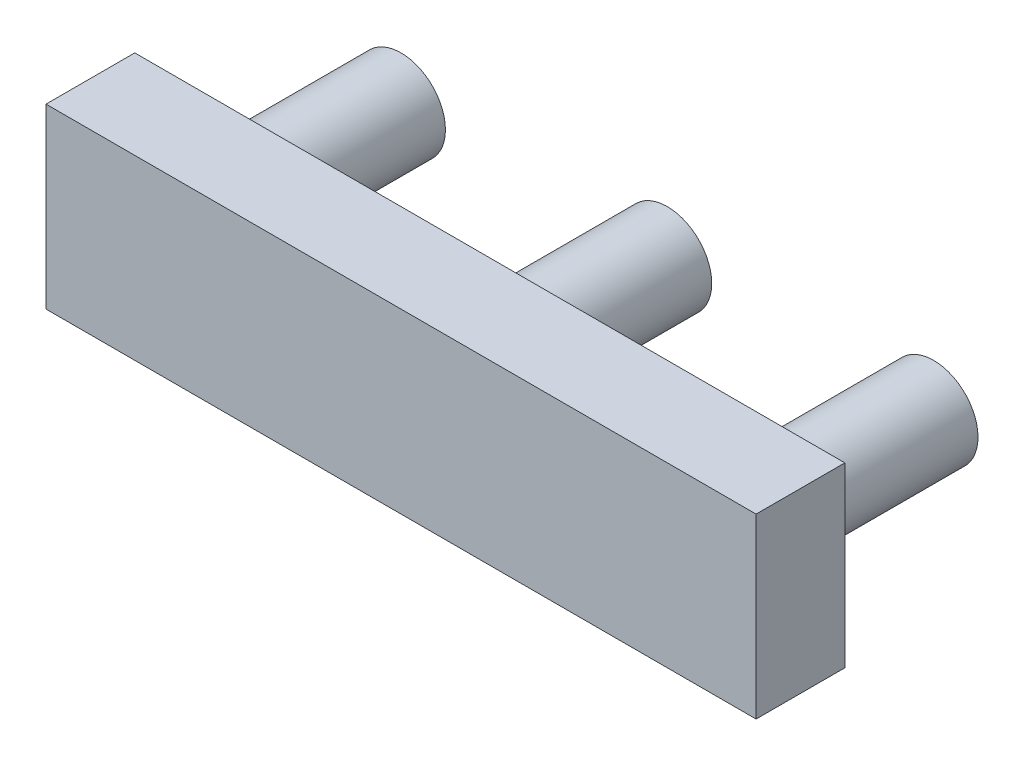
ISO-10303-21;
HEADER;
FILE_DESCRIPTION(('STEP AP214'),'2;1');
FILE_NAME('part.step','',(''),(''),'','','');
FILE_SCHEMA(('AUTOMOTIVE_DESIGN { 1 0 10303 214 1 1 1 1 }'));
ENDSEC;
DATA;
#1=APPLICATION_CONTEXT('core data for automotive mechanical design processes');
#2=APPLICATION_PROTOCOL_DEFINITION('international standard','automotive_design',2000,#1);
#3=PRODUCT_CONTEXT('',#1,'mechanical');
#4=PRODUCT('Part','Part','',(#3));
#5=PRODUCT_RELATED_PRODUCT_CATEGORY('part','',(#4));
#6=PRODUCT_DEFINITION_FORMATION('','',#4);
#7=PRODUCT_DEFINITION_CONTEXT('part definition',#1,'design');
#8=PRODUCT_DEFINITION('design','',#6,#7);
#9=PRODUCT_DEFINITION_SHAPE('','',#8);
#10=(LENGTH_UNIT() NAMED_UNIT(*) SI_UNIT(.MILLI.,.METRE.));
#11=(NAMED_UNIT(*) PLANE_ANGLE_UNIT() SI_UNIT($,.RADIAN.));
#12=(NAMED_UNIT(*) SI_UNIT($,.STERADIAN.) SOLID_ANGLE_UNIT());
#13=UNCERTAINTY_MEASURE_WITH_UNIT(LENGTH_MEASURE(1.E-05),#10,'distance_accuracy_value','');
#14=(GEOMETRIC_REPRESENTATION_CONTEXT(3) GLOBAL_UNCERTAINTY_ASSIGNED_CONTEXT((#13)) GLOBAL_UNIT_ASSIGNED_CONTEXT((#10,
#11,#12)) REPRESENTATION_CONTEXT('',''));
#15=CARTESIAN_POINT('',(0.,0.,0.));
#16=DIRECTION('',(0.,0.,1.));
#17=DIRECTION('',(1.,0.,0.));
#18=AXIS2_PLACEMENT_3D('',#15,#16,#17);
#19=CARTESIAN_POINT('',(0.,0.,12.7));
#20=DIRECTION('',(0.,0.,-1.));
#21=DIRECTION('',(-1.,0.,0.));
#22=AXIS2_PLACEMENT_3D('',#19,#20,#21);
#23=CYLINDRICAL_SURFACE('',#22,3.175);
#24=CARTESIAN_POINT('',(0.,0.,12.7));
#25=DIRECTION('',(0.,0.,1.));
#26=DIRECTION('',(1.,0.,0.));
#27=AXIS2_PLACEMENT_3D('',#24,#25,#26);
#28=CIRCLE('',#27,3.175);
#29=CARTESIAN_POINT('',(3.175,0.,12.7));
#30=VERTEX_POINT('',#29);
#31=EDGE_CURVE('E11',#30,#30,#28,.T.);
#32=ORIENTED_EDGE('',*,*,#31,.F.);
#33=EDGE_LOOP('',(#32));
#34=FACE_BOUND('',#33,.T.);
#35=CARTESIAN_POINT('',(0.,0.,0.));
#36=DIRECTION('',(0.,0.,1.));
#37=DIRECTION('',(1.,0.,0.));
#38=AXIS2_PLACEMENT_3D('',#35,#36,#37);
#39=CIRCLE('',#38,3.175);
#40=CARTESIAN_POINT('',(3.175,0.,0.));
#41=VERTEX_POINT('',#40);
#42=EDGE_CURVE('E36',#41,#41,#39,.T.);
#43=ORIENTED_EDGE('',*,*,#42,.T.);
#44=EDGE_LOOP('',(#43));
#45=FACE_BOUND('',#44,.T.);
#46=ADVANCED_FACE('F33',(#34,#45),#23,.T.);
#47=CARTESIAN_POINT('',(0.,0.,0.));
#48=DIRECTION('',(0.,0.,1.));
#49=DIRECTION('',(1.,0.,0.));
#50=AXIS2_PLACEMENT_3D('',#47,#48,#49);
#51=PLANE('',#50);
#52=ORIENTED_EDGE('',*,*,#42,.F.);
#53=EDGE_LOOP('',(#52));
#54=FACE_BOUND('',#53,.T.);
#55=ADVANCED_FACE('F113',(#54),#51,.F.);
#56=CARTESIAN_POINT('',(25.4,-6.35,19.05));
#57=DIRECTION('',(-1.,0.,0.));
#58=DIRECTION('',(0.,0.,1.));
#59=AXIS2_PLACEMENT_3D('',#56,#57,#58);
#60=PLANE('',#59);
#61=DIRECTION('',(0.,1.,0.));
#62=VECTOR('',#61,1.);
#63=CARTESIAN_POINT('',(25.4,-6.35,12.7));
#64=LINE('',#63,#62);
#65=CARTESIAN_POINT('',(25.4,-6.35,12.7));
#66=VERTEX_POINT('',#65);
#67=CARTESIAN_POINT('',(25.4,6.35,12.7));
#68=VERTEX_POINT('',#67);
#69=EDGE_CURVE('E100',#66,#68,#64,.T.);
#70=ORIENTED_EDGE('',*,*,#69,.T.);
#71=DIRECTION('',(0.,0.,-1.));
#72=VECTOR('',#71,1.);
#73=CARTESIAN_POINT('',(25.4,6.35,19.05));
#74=LINE('',#73,#72);
#75=CARTESIAN_POINT('',(25.4,6.35,19.05));
#76=VERTEX_POINT('',#75);
#77=EDGE_CURVE('E91',#76,#68,#74,.T.);
#78=ORIENTED_EDGE('',*,*,#77,.F.);
#79=DIRECTION('',(0.,1.,0.));
#80=VECTOR('',#79,1.);
#81=CARTESIAN_POINT('',(25.4,-6.35,19.05));
#82=LINE('',#81,#80);
#83=CARTESIAN_POINT('',(25.4,-6.35,19.05));
#84=VERTEX_POINT('',#83);
#85=EDGE_CURVE('E85',#84,#76,#82,.T.);
#86=ORIENTED_EDGE('',*,*,#85,.F.);
#87=DIRECTION('',(0.,0.,-1.));
#88=VECTOR('',#87,1.);
#89=CARTESIAN_POINT('',(25.4,-6.35,19.05));
#90=LINE('',#89,#88);
#91=EDGE_CURVE('E96',#84,#66,#90,.T.);
#92=ORIENTED_EDGE('',*,*,#91,.T.);
#93=EDGE_LOOP('',(#70,#78,#86,#92));
#94=FACE_BOUND('',#93,.T.);
#95=ADVANCED_FACE('F115',(#94),#60,.F.);
#96=CARTESIAN_POINT('',(-25.4,6.35,19.05));
#97=DIRECTION('',(0.,-1.,0.));
#98=DIRECTION('',(0.,0.,-1.));
#99=AXIS2_PLACEMENT_3D('',#96,#97,#98);
#100=PLANE('',#99);
#101=DIRECTION('',(-1.,0.,0.));
#102=VECTOR('',#101,1.);
#103=CARTESIAN_POINT('',(-25.4,6.35,12.7));
#104=LINE('',#103,#102);
#105=CARTESIAN_POINT('',(-25.4,6.35,12.7));
#106=VERTEX_POINT('',#105);
#107=EDGE_CURVE('E90',#68,#106,#104,.T.);
#108=ORIENTED_EDGE('',*,*,#107,.T.);
#109=DIRECTION('',(0.,0.,-1.));
#110=VECTOR('',#109,1.);
#111=CARTESIAN_POINT('',(-25.4,6.35,19.05));
#112=LINE('',#111,#110);
#113=CARTESIAN_POINT('',(-25.4,6.35,19.05));
#114=VERTEX_POINT('',#113);
#115=EDGE_CURVE('E88',#114,#106,#112,.T.);
#116=ORIENTED_EDGE('',*,*,#115,.F.);
#117=DIRECTION('',(-1.,0.,0.));
#118=VECTOR('',#117,1.);
#119=CARTESIAN_POINT('',(-25.4,6.35,19.05));
#120=LINE('',#119,#118);
#121=EDGE_CURVE('E80',#76,#114,#120,.T.);
#122=ORIENTED_EDGE('',*,*,#121,.F.);
#123=ORIENTED_EDGE('',*,*,#77,.T.);
#124=EDGE_LOOP('',(#108,#116,#122,#123));
#125=FACE_BOUND('',#124,.T.);
#126=ADVANCED_FACE('F89',(#125),#100,.F.);
#127=CARTESIAN_POINT('',(-25.4,-6.35,19.05));
#128=DIRECTION('',(1.,0.,0.));
#129=DIRECTION('',(0.,0.,-1.));
#130=AXIS2_PLACEMENT_3D('',#127,#128,#129);
#131=PLANE('',#130);
#132=DIRECTION('',(0.,-1.,0.));
#133=VECTOR('',#132,1.);
#134=CARTESIAN_POINT('',(-25.4,-6.35,12.7));
#135=LINE('',#134,#133);
#136=CARTESIAN_POINT('',(-25.4,-6.35,12.7));
#137=VERTEX_POINT('',#136);
#138=EDGE_CURVE('E66',#106,#137,#135,.T.);
#139=ORIENTED_EDGE('',*,*,#138,.T.);
#140=DIRECTION('',(0.,0.,-1.));
#141=VECTOR('',#140,1.);
#142=CARTESIAN_POINT('',(-25.4,-6.35,19.05));
#143=LINE('',#142,#141);
#144=CARTESIAN_POINT('',(-25.4,-6.35,19.05));
#145=VERTEX_POINT('',#144);
#146=EDGE_CURVE('E92',#145,#137,#143,.T.);
#147=ORIENTED_EDGE('',*,*,#146,.F.);
#148=DIRECTION('',(0.,-1.,0.));
#149=VECTOR('',#148,1.);
#150=CARTESIAN_POINT('',(-25.4,-6.35,19.05));
#151=LINE('',#150,#149);
#152=EDGE_CURVE('E83',#114,#145,#151,.T.);
#153=ORIENTED_EDGE('',*,*,#152,.F.);
#154=ORIENTED_EDGE('',*,*,#115,.T.);
#155=EDGE_LOOP('',(#139,#147,#153,#154));
#156=FACE_BOUND('',#155,.T.);
#157=ADVANCED_FACE('F94',(#156),#131,.F.);
#158=CARTESIAN_POINT('',(-25.4,-6.35,19.05));
#159=DIRECTION('',(0.,1.,0.));
#160=DIRECTION('',(0.,0.,1.));
#161=AXIS2_PLACEMENT_3D('',#158,#159,#160);
#162=PLANE('',#161);
#163=DIRECTION('',(1.,0.,0.));
#164=VECTOR('',#163,1.);
#165=CARTESIAN_POINT('',(-25.4,-6.35,12.7));
#166=LINE('',#165,#164);
#167=EDGE_CURVE('E72',#137,#66,#166,.T.);
#168=ORIENTED_EDGE('',*,*,#167,.T.);
#169=ORIENTED_EDGE('',*,*,#91,.F.);
#170=DIRECTION('',(1.,0.,0.));
#171=VECTOR('',#170,1.);
#172=CARTESIAN_POINT('',(-25.4,-6.35,19.05));
#173=LINE('',#172,#171);
#174=EDGE_CURVE('E49',#145,#84,#173,.T.);
#175=ORIENTED_EDGE('',*,*,#174,.F.);
#176=ORIENTED_EDGE('',*,*,#146,.T.);
#177=EDGE_LOOP('',(#168,#169,#175,#176));
#178=FACE_BOUND('',#177,.T.);
#179=ADVANCED_FACE('F128',(#178),#162,.F.);
#180=CARTESIAN_POINT('',(0.,0.,19.05));
#181=DIRECTION('',(0.,0.,-1.));
#182=DIRECTION('',(-1.,0.,0.));
#183=AXIS2_PLACEMENT_3D('',#180,#181,#182);
#184=PLANE('',#183);
#185=ORIENTED_EDGE('',*,*,#85,.T.);
#186=ORIENTED_EDGE('',*,*,#121,.T.);
#187=ORIENTED_EDGE('',*,*,#152,.T.);
#188=ORIENTED_EDGE('',*,*,#174,.T.);
#189=EDGE_LOOP('',(#185,#186,#187,#188));
#190=FACE_BOUND('',#189,.T.);
#191=ADVANCED_FACE('F81',(#190),#184,.F.);
#192=CARTESIAN_POINT('',(0.,0.,12.7));
#193=DIRECTION('',(0.,0.,-1.));
#194=DIRECTION('',(-1.,0.,0.));
#195=AXIS2_PLACEMENT_3D('',#192,#193,#194);
#196=PLANE('',#195);
#197=CARTESIAN_POINT('',(-19.05,0.,12.7));
#198=DIRECTION('',(0.,0.,1.));
#199=DIRECTION('',(1.,0.,0.));
#200=AXIS2_PLACEMENT_3D('',#197,#198,#199);
#201=CIRCLE('',#200,3.175);
#202=CARTESIAN_POINT('',(-15.875,0.,12.7));
#203=VERTEX_POINT('',#202);
#204=EDGE_CURVE('E158',#203,#203,#201,.T.);
#205=ORIENTED_EDGE('',*,*,#204,.T.);
#206=EDGE_LOOP('',(#205));
#207=FACE_BOUND('',#206,.T.);
#208=CARTESIAN_POINT('',(19.05,0.,12.7));
#209=DIRECTION('',(0.,0.,1.));
#210=DIRECTION('',(1.,0.,0.));
#211=AXIS2_PLACEMENT_3D('',#208,#209,#210);
#212=CIRCLE('',#211,3.175);
#213=CARTESIAN_POINT('',(22.225,0.,12.7));
#214=VERTEX_POINT('',#213);
#215=EDGE_CURVE('E103',#214,#214,#212,.T.);
#216=ORIENTED_EDGE('',*,*,#215,.T.);
#217=EDGE_LOOP('',(#216));
#218=FACE_BOUND('',#217,.T.);
#219=ORIENTED_EDGE('',*,*,#31,.T.);
#220=EDGE_LOOP('',(#219));
#221=FACE_BOUND('',#220,.T.);
#222=ORIENTED_EDGE('',*,*,#69,.F.);
#223=ORIENTED_EDGE('',*,*,#167,.F.);
#224=ORIENTED_EDGE('',*,*,#138,.F.);
#225=ORIENTED_EDGE('',*,*,#107,.F.);
#226=EDGE_LOOP('',(#222,#223,#224,#225));
#227=FACE_BOUND('',#226,.T.);
#228=ADVANCED_FACE('F131',(#207,#218,#221,#227),#196,.T.);
#229=CARTESIAN_POINT('',(19.05,0.,12.7));
#230=DIRECTION('',(0.,0.,-1.));
#231=DIRECTION('',(-1.,0.,0.));
#232=AXIS2_PLACEMENT_3D('',#229,#230,#231);
#233=CYLINDRICAL_SURFACE('',#232,3.175);
#234=ORIENTED_EDGE('',*,*,#215,.F.);
#235=EDGE_LOOP('',(#234));
#236=FACE_BOUND('',#235,.T.);
#237=CARTESIAN_POINT('',(19.05,0.,0.));
#238=DIRECTION('',(0.,0.,1.));
#239=DIRECTION('',(1.,0.,0.));
#240=AXIS2_PLACEMENT_3D('',#237,#238,#239);
#241=CIRCLE('',#240,3.175);
#242=CARTESIAN_POINT('',(22.225,0.,0.));
#243=VERTEX_POINT('',#242);
#244=EDGE_CURVE('E161',#243,#243,#241,.T.);
#245=ORIENTED_EDGE('',*,*,#244,.T.);
#246=EDGE_LOOP('',(#245));
#247=FACE_BOUND('',#246,.T.);
#248=ADVANCED_FACE('F134',(#236,#247),#233,.T.);
#249=CARTESIAN_POINT('',(19.05,0.,0.));
#250=DIRECTION('',(0.,0.,1.));
#251=DIRECTION('',(1.,0.,0.));
#252=AXIS2_PLACEMENT_3D('',#249,#250,#251);
#253=PLANE('',#252);
#254=ORIENTED_EDGE('',*,*,#244,.F.);
#255=EDGE_LOOP('',(#254));
#256=FACE_BOUND('',#255,.T.);
#257=ADVANCED_FACE('F140',(#256),#253,.F.);
#258=CARTESIAN_POINT('',(-19.05,0.,12.7));
#259=DIRECTION('',(0.,0.,-1.));
#260=DIRECTION('',(-1.,0.,0.));
#261=AXIS2_PLACEMENT_3D('',#258,#259,#260);
#262=CYLINDRICAL_SURFACE('',#261,3.175);
#263=ORIENTED_EDGE('',*,*,#204,.F.);
#264=EDGE_LOOP('',(#263));
#265=FACE_BOUND('',#264,.T.);
#266=CARTESIAN_POINT('',(-19.05,0.,0.));
#267=DIRECTION('',(0.,0.,1.));
#268=DIRECTION('',(1.,0.,0.));
#269=AXIS2_PLACEMENT_3D('',#266,#267,#268);
#270=CIRCLE('',#269,3.175);
#271=CARTESIAN_POINT('',(-15.875,0.,0.));
#272=VERTEX_POINT('',#271);
#273=EDGE_CURVE('E156',#272,#272,#270,.T.);
#274=ORIENTED_EDGE('',*,*,#273,.T.);
#275=EDGE_LOOP('',(#274));
#276=FACE_BOUND('',#275,.T.);
#277=ADVANCED_FACE('F144',(#265,#276),#262,.T.);
#278=CARTESIAN_POINT('',(-19.05,0.,0.));
#279=DIRECTION('',(0.,0.,1.));
#280=DIRECTION('',(1.,0.,0.));
#281=AXIS2_PLACEMENT_3D('',#278,#279,#280);
#282=PLANE('',#281);
#283=ORIENTED_EDGE('',*,*,#273,.F.);
#284=EDGE_LOOP('',(#283));
#285=FACE_BOUND('',#284,.T.);
#286=ADVANCED_FACE('F148',(#285),#282,.F.);
#287=CLOSED_SHELL('',(#46,#55,#95,#126,#157,#179,#191,#228,#248,#257,#277,#286));
#288=MANIFOLD_SOLID_BREP('B2',#287);
#289=ADVANCED_BREP_SHAPE_REPRESENTATION('',(#18,#288),#14);
#290=SHAPE_DEFINITION_REPRESENTATION(#9,#289);
ENDSEC;
END-ISO-10303-21;
